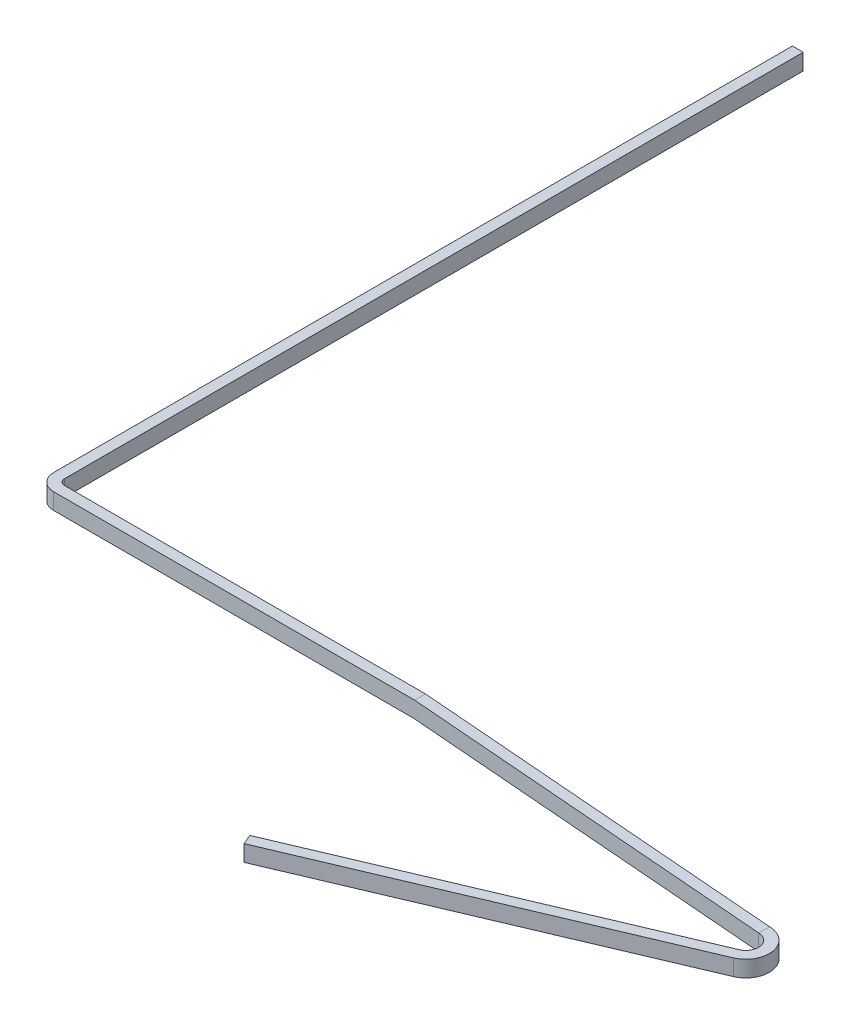
ISO-10303-21;
HEADER;
FILE_DESCRIPTION(('STEP AP214'),'2;1');
FILE_NAME('part.step','',(''),(''),'','','');
FILE_SCHEMA(('AUTOMOTIVE_DESIGN { 1 0 10303 214 1 1 1 1 }'));
ENDSEC;
DATA;
#1=APPLICATION_CONTEXT('core data for automotive mechanical design processes');
#2=APPLICATION_PROTOCOL_DEFINITION('international standard','automotive_design',2000,#1);
#3=PRODUCT_CONTEXT('',#1,'mechanical');
#4=PRODUCT('Part','Part','',(#3));
#5=PRODUCT_RELATED_PRODUCT_CATEGORY('part','',(#4));
#6=PRODUCT_DEFINITION_FORMATION('','',#4);
#7=PRODUCT_DEFINITION_CONTEXT('part definition',#1,'design');
#8=PRODUCT_DEFINITION('design','',#6,#7);
#9=PRODUCT_DEFINITION_SHAPE('','',#8);
#10=(LENGTH_UNIT() NAMED_UNIT(*) SI_UNIT(.MILLI.,.METRE.));
#11=(NAMED_UNIT(*) PLANE_ANGLE_UNIT() SI_UNIT($,.RADIAN.));
#12=(NAMED_UNIT(*) SI_UNIT($,.STERADIAN.) SOLID_ANGLE_UNIT());
#13=UNCERTAINTY_MEASURE_WITH_UNIT(LENGTH_MEASURE(1.E-05),#10,'distance_accuracy_value','');
#14=(GEOMETRIC_REPRESENTATION_CONTEXT(3) GLOBAL_UNCERTAINTY_ASSIGNED_CONTEXT((#13)) GLOBAL_UNIT_ASSIGNED_CONTEXT((#10,
#11,#12)) REPRESENTATION_CONTEXT('',''));
#15=CARTESIAN_POINT('',(0.,0.,0.));
#16=DIRECTION('',(0.,0.,1.));
#17=DIRECTION('',(1.,0.,0.));
#18=AXIS2_PLACEMENT_3D('',#15,#16,#17);
#19=CARTESIAN_POINT('',(0.31,-1.05262000002874,20.64));
#20=DIRECTION('',(0.,0.,-1.));
#21=DIRECTION('',(0.,1.,0.));
#22=AXIS2_PLACEMENT_3D('',#19,#20,#21);
#23=PLANE('',#22);
#24=DIRECTION('',(1.,0.,0.));
#25=VECTOR('',#24,1.);
#26=CARTESIAN_POINT('',(5.07517399165728,-0.225,20.64));
#27=LINE('',#26,#25);
#28=CARTESIAN_POINT('',(0.31,-0.225,20.64));
#29=VERTEX_POINT('',#28);
#30=CARTESIAN_POINT('',(10.3003479833146,-0.225,20.64));
#31=VERTEX_POINT('',#30);
#32=EDGE_CURVE('E192',#29,#31,#27,.T.);
#33=ORIENTED_EDGE('',*,*,#32,.F.);
#34=DIRECTION('',(0.,-1.,0.));
#35=VECTOR('',#34,1.);
#36=CARTESIAN_POINT('',(0.31,0.,20.64));
#37=LINE('',#36,#35);
#38=CARTESIAN_POINT('',(0.31,0.225,20.64));
#39=VERTEX_POINT('',#38);
#40=EDGE_CURVE('E152',#39,#29,#37,.T.);
#41=ORIENTED_EDGE('',*,*,#40,.F.);
#42=DIRECTION('',(-1.,0.,0.));
#43=VECTOR('',#42,1.);
#44=CARTESIAN_POINT('',(5.08482600834272,0.225,20.64));
#45=LINE('',#44,#43);
#46=CARTESIAN_POINT('',(10.3196520166854,0.225,20.64));
#47=VERTEX_POINT('',#46);
#48=EDGE_CURVE('E149',#47,#39,#45,.T.);
#49=ORIENTED_EDGE('',*,*,#48,.F.);
#50=DIRECTION('',(-0.996326309019234,0.0856381104188439,0.));
#51=VECTOR('',#50,1.);
#52=CARTESIAN_POINT('',(15.0896520166854,-0.185,20.64));
#53=LINE('',#52,#51);
#54=CARTESIAN_POINT('',(19.8596515427837,-0.595,20.6400404185195));
#55=VERTEX_POINT('',#54);
#56=EDGE_CURVE('E138',#55,#47,#53,.T.);
#57=ORIENTED_EDGE('',*,*,#56,.F.);
#58=CARTESIAN_POINT('',(19.8403479832355,-1.04500000000048,20.6399976074993));
#59=CARTESIAN_POINT('',(19.8410557517331,-1.02624965485285,20.6399975918096));
#60=CARTESIAN_POINT('',(19.8417718971182,-1.00749962029694,20.6399975950357));
#61=CARTESIAN_POINT('',(19.8432255705605,-0.969999551143934,20.6399976941499));
#62=CARTESIAN_POINT('',(19.8439630995611,-0.951249516583446,20.6399977900421));
#63=CARTESIAN_POINT('',(19.8454641491901,-0.913749439144669,20.6399981293394));
#64=CARTESIAN_POINT('',(19.8462276712638,-0.89499939632408,20.6399983727527));
#65=CARTESIAN_POINT('',(19.8477859711793,-0.857499324094485,20.6399988555051));
#66=CARTESIAN_POINT('',(19.8485807511506,-0.838749294773724,20.6399990948439));
#67=CARTESIAN_POINT('',(19.8502041974186,-0.801249378775152,20.6400002436646));
#68=CARTESIAN_POINT('',(19.8510328661086,-0.782499492201277,20.640001153194));
#69=CARTESIAN_POINT('',(19.8527078000249,-0.744999591802991,20.6400075352819));
#70=CARTESIAN_POINT('',(19.8535540661088,-0.726249578017113,20.6400130080634));
#71=CARTESIAN_POINT('',(19.8552657138619,-0.68874957837579,20.6400276802666));
#72=CARTESIAN_POINT('',(19.8561310963895,-0.669999592559558,20.6400368798558));
#73=CARTESIAN_POINT('',(19.8578787320751,-0.632499620895884,20.6400591797775));
#74=CARTESIAN_POINT('',(19.8587609859392,-0.613749635081437,20.6400722802736));
#75=CARTESIAN_POINT('',(19.8596505349446,-0.595,20.640087417897));
#76=B_SPLINE_CURVE_WITH_KNOTS('',3,(#58,#59,#60,#61,#62,#63,#64,#65,#66,#67,#68,#69,#70,#71,#72,
#73,#74,#75),.UNSPECIFIED.,.F.,.F.,(4,2,2,2,2,2,2,2,4),(0.,0.056291101953052,0.112584691452661,
0.168881416278623,0.225181983163097,0.281486533129505,0.337793833823625,0.394103667974869,
0.450415864321464),.UNSPECIFIED.);
#77=CARTESIAN_POINT('',(19.8403479832985,-1.04500000000571,20.6399995214999));
#78=VERTEX_POINT('',#77);
#79=EDGE_CURVE('E216',#55,#78,#76,.F.);
#80=ORIENTED_EDGE('',*,*,#79,.T.);
#81=DIRECTION('',(0.996326309019234,-0.0856381104188441,0.));
#82=VECTOR('',#81,1.);
#83=CARTESIAN_POINT('',(15.0703479833146,-0.635,20.64));
#84=LINE('',#83,#82);
#85=EDGE_CURVE('E171',#31,#78,#84,.T.);
#86=ORIENTED_EDGE('',*,*,#85,.F.);
#87=EDGE_LOOP('',(#33,#41,#49,#57,#80,#86));
#88=FACE_BOUND('',#87,.T.);
#89=ADVANCED_FACE('F15',(#88),#23,.T.);
#90=CARTESIAN_POINT('',(0.31,-0.27,20.48));
#91=DIRECTION('',(0.,1.,0.));
#92=DIRECTION('',(0.,0.,1.));
#93=AXIS2_PLACEMENT_3D('',#90,#91,#92);
#94=CYLINDRICAL_SURFACE('',#93,0.160000000000002);
#95=DIRECTION('',(0.,-1.,0.));
#96=VECTOR('',#95,1.);
#97=CARTESIAN_POINT('',(0.15,0.,20.48));
#98=LINE('',#97,#96);
#99=CARTESIAN_POINT('',(0.149999999999986,0.225,20.48));
#100=VERTEX_POINT('',#99);
#101=CARTESIAN_POINT('',(0.149999999999981,-0.225,20.48));
#102=VERTEX_POINT('',#101);
#103=EDGE_CURVE('E93',#100,#102,#98,.T.);
#104=ORIENTED_EDGE('',*,*,#103,.F.);
#105=CARTESIAN_POINT('',(0.31,0.225,20.48));
#106=DIRECTION('',(0.,1.,0.));
#107=DIRECTION('',(0.,0.,1.));
#108=AXIS2_PLACEMENT_3D('',#105,#106,#107);
#109=CIRCLE('',#108,0.160000000000002);
#110=EDGE_CURVE('E156',#39,#100,#109,.F.);
#111=ORIENTED_EDGE('',*,*,#110,.F.);
#112=ORIENTED_EDGE('',*,*,#40,.T.);
#113=CARTESIAN_POINT('',(0.31,-0.225,20.48));
#114=DIRECTION('',(0.,1.,0.));
#115=DIRECTION('',(0.,0.,1.));
#116=AXIS2_PLACEMENT_3D('',#113,#114,#115);
#117=CIRCLE('',#116,0.160000000000002);
#118=EDGE_CURVE('E19',#102,#29,#117,.T.);
#119=ORIENTED_EDGE('',*,*,#118,.F.);
#120=EDGE_LOOP('',(#104,#111,#112,#119));
#121=FACE_BOUND('',#120,.T.);
#122=ADVANCED_FACE('F367',(#121),#94,.F.);
#123=CARTESIAN_POINT('',(0.15,-0.225,0.));
#124=DIRECTION('',(1.,0.,0.));
#125=DIRECTION('',(0.,1.,0.));
#126=AXIS2_PLACEMENT_3D('',#123,#124,#125);
#127=PLANE('',#126);
#128=DIRECTION('',(0.,-1.,0.));
#129=VECTOR('',#128,1.);
#130=CARTESIAN_POINT('',(0.15,0.,0.));
#131=LINE('',#130,#129);
#132=CARTESIAN_POINT('',(0.149999999999981,0.225,0.));
#133=VERTEX_POINT('',#132);
#134=CARTESIAN_POINT('',(0.149999999999981,-0.225,0.));
#135=VERTEX_POINT('',#134);
#136=EDGE_CURVE('E105',#133,#135,#131,.T.);
#137=ORIENTED_EDGE('',*,*,#136,.F.);
#138=DIRECTION('',(0.,0.,-1.));
#139=VECTOR('',#138,1.);
#140=CARTESIAN_POINT('',(0.149999999999971,0.225,10.47));
#141=LINE('',#140,#139);
#142=EDGE_CURVE('E209',#100,#133,#141,.T.);
#143=ORIENTED_EDGE('',*,*,#142,.F.);
#144=ORIENTED_EDGE('',*,*,#103,.T.);
#145=DIRECTION('',(0.,0.,1.));
#146=VECTOR('',#145,1.);
#147=CARTESIAN_POINT('',(0.149999999999962,-0.225,10.47));
#148=LINE('',#147,#146);
#149=EDGE_CURVE('E183',#135,#102,#148,.T.);
#150=ORIENTED_EDGE('',*,*,#149,.F.);
#151=EDGE_LOOP('',(#137,#143,#144,#150));
#152=FACE_BOUND('',#151,.T.);
#153=ADVANCED_FACE('F369',(#152),#127,.T.);
#154=CARTESIAN_POINT('',(0.15,-0.225,0.));
#155=DIRECTION('',(0.,0.,-1.));
#156=DIRECTION('',(-1.,0.,0.));
#157=AXIS2_PLACEMENT_3D('',#154,#155,#156);
#158=PLANE('',#157);
#159=DIRECTION('',(0.,-1.,0.));
#160=VECTOR('',#159,1.);
#161=CARTESIAN_POINT('',(-0.15,0.,0.));
#162=LINE('',#161,#160);
#163=CARTESIAN_POINT('',(-0.15,0.225,0.));
#164=VERTEX_POINT('',#163);
#165=CARTESIAN_POINT('',(-0.15,-0.225,0.));
#166=VERTEX_POINT('',#165);
#167=EDGE_CURVE('E197',#164,#166,#162,.T.);
#168=ORIENTED_EDGE('',*,*,#167,.F.);
#169=DIRECTION('',(-1.,0.,0.));
#170=VECTOR('',#169,1.);
#171=CARTESIAN_POINT('',(5.08482600834272,0.225,0.));
#172=LINE('',#171,#170);
#173=EDGE_CURVE('E205',#133,#164,#172,.T.);
#174=ORIENTED_EDGE('',*,*,#173,.F.);
#175=ORIENTED_EDGE('',*,*,#136,.T.);
#176=DIRECTION('',(1.,0.,0.));
#177=VECTOR('',#176,1.);
#178=CARTESIAN_POINT('',(5.07517399165728,-0.225,0.));
#179=LINE('',#178,#177);
#180=EDGE_CURVE('E186',#166,#135,#179,.T.);
#181=ORIENTED_EDGE('',*,*,#180,.F.);
#182=EDGE_LOOP('',(#168,#174,#175,#181));
#183=FACE_BOUND('',#182,.T.);
#184=ADVANCED_FACE('F371',(#183),#158,.T.);
#185=CARTESIAN_POINT('',(-0.15,0.225,0.));
#186=DIRECTION('',(-1.,0.,0.));
#187=DIRECTION('',(0.,-1.,0.));
#188=AXIS2_PLACEMENT_3D('',#185,#186,#187);
#189=PLANE('',#188);
#190=DIRECTION('',(0.,0.,1.));
#191=VECTOR('',#190,1.);
#192=CARTESIAN_POINT('',(-0.15,0.225,10.47));
#193=LINE('',#192,#191);
#194=CARTESIAN_POINT('',(-0.15,0.225,20.48));
#195=VERTEX_POINT('',#194);
#196=EDGE_CURVE('E208',#164,#195,#193,.T.);
#197=ORIENTED_EDGE('',*,*,#196,.F.);
#198=ORIENTED_EDGE('',*,*,#167,.T.);
#199=DIRECTION('',(0.,0.,-1.));
#200=VECTOR('',#199,1.);
#201=CARTESIAN_POINT('',(-0.15,-0.225,10.47));
#202=LINE('',#201,#200);
#203=CARTESIAN_POINT('',(-0.15,-0.225,20.48));
#204=VERTEX_POINT('',#203);
#205=EDGE_CURVE('E189',#204,#166,#202,.T.);
#206=ORIENTED_EDGE('',*,*,#205,.F.);
#207=DIRECTION('',(0.,1.,0.));
#208=VECTOR('',#207,1.);
#209=CARTESIAN_POINT('',(-0.15,0.,20.48));
#210=LINE('',#209,#208);
#211=EDGE_CURVE('E200',#204,#195,#210,.T.);
#212=ORIENTED_EDGE('',*,*,#211,.T.);
#213=EDGE_LOOP('',(#197,#198,#206,#212));
#214=FACE_BOUND('',#213,.T.);
#215=ADVANCED_FACE('F404',(#214),#189,.T.);
#216=CARTESIAN_POINT('',(-0.15,-0.225,20.94));
#217=DIRECTION('',(0.,-1.,0.));
#218=DIRECTION('',(0.,0.,-1.));
#219=AXIS2_PLACEMENT_3D('',#216,#217,#218);
#220=PLANE('',#219);
#221=ORIENTED_EDGE('',*,*,#149,.T.);
#222=ORIENTED_EDGE('',*,*,#118,.T.);
#223=ORIENTED_EDGE('',*,*,#32,.T.);
#224=DIRECTION('',(0.,0.,-1.));
#225=VECTOR('',#224,1.);
#226=CARTESIAN_POINT('',(10.3003479833146,-0.225,20.79));
#227=LINE('',#226,#225);
#228=CARTESIAN_POINT('',(10.3003479833146,-0.224999999999997,20.94));
#229=VERTEX_POINT('',#228);
#230=EDGE_CURVE('E170',#229,#31,#227,.T.);
#231=ORIENTED_EDGE('',*,*,#230,.F.);
#232=DIRECTION('',(1.,0.,0.));
#233=VECTOR('',#232,1.);
#234=CARTESIAN_POINT('',(10.1434749643928,-0.224999999999998,20.94));
#235=LINE('',#234,#233);
#236=CARTESIAN_POINT('',(0.310000000000003,-0.224999999999999,20.94));
#237=VERTEX_POINT('',#236);
#238=EDGE_CURVE('E178',#237,#229,#235,.T.);
#239=ORIENTED_EDGE('',*,*,#238,.F.);
#240=CARTESIAN_POINT('',(0.310000000000006,-0.225,20.48));
#241=DIRECTION('',(0.,1.,0.));
#242=DIRECTION('',(0.,0.,1.));
#243=AXIS2_PLACEMENT_3D('',#240,#241,#242);
#244=CIRCLE('',#243,0.460000000000002);
#245=EDGE_CURVE('E339',#204,#237,#244,.T.);
#246=ORIENTED_EDGE('',*,*,#245,.F.);
#247=ORIENTED_EDGE('',*,*,#205,.T.);
#248=ORIENTED_EDGE('',*,*,#180,.T.);
#249=EDGE_LOOP('',(#221,#222,#223,#231,#239,#246,#247,#248));
#250=FACE_BOUND('',#249,.T.);
#251=ADVANCED_FACE('F379',(#250),#220,.T.);
#252=CARTESIAN_POINT('',(10.3003479833146,-0.225,20.64));
#253=DIRECTION('',(-0.0856381104188441,-0.996326309019234,0.));
#254=DIRECTION('',(0.996326309019234,-0.0856381104188441,0.));
#255=AXIS2_PLACEMENT_3D('',#252,#253,#254);
#256=PLANE('',#255);
#257=DIRECTION('',(0.996326309019234,-0.0856381104188441,0.));
#258=VECTOR('',#257,1.);
#259=CARTESIAN_POINT('',(10.3003479833146,-0.224999999999998,20.94));
#260=LINE('',#259,#258);
#261=CARTESIAN_POINT('',(19.8403479833014,-1.045,20.9399997496721));
#262=VERTEX_POINT('',#261);
#263=EDGE_CURVE('E181',#229,#262,#260,.T.);
#264=ORIENTED_EDGE('',*,*,#263,.F.);
#265=ORIENTED_EDGE('',*,*,#230,.T.);
#266=ORIENTED_EDGE('',*,*,#85,.T.);
#267=DIRECTION('',(0.,0.,1.));
#268=VECTOR('',#267,1.);
#269=CARTESIAN_POINT('',(19.8403479833145,-1.045,20.79));
#270=LINE('',#269,#268);
#271=EDGE_CURVE('E128',#78,#262,#270,.T.);
#272=ORIENTED_EDGE('',*,*,#271,.T.);
#273=EDGE_LOOP('',(#264,#265,#266,#272));
#274=FACE_BOUND('',#273,.T.);
#275=ADVANCED_FACE('F394',(#274),#256,.T.);
#276=CARTESIAN_POINT('',(19.8596520166855,-0.595,20.64));
#277=DIRECTION('',(0.0856381104188439,0.996326309019234,0.));
#278=DIRECTION('',(-0.996326309019234,0.0856381104188439,0.));
#279=AXIS2_PLACEMENT_3D('',#276,#277,#278);
#280=PLANE('',#279);
#281=ORIENTED_EDGE('',*,*,#56,.T.);
#282=DIRECTION('',(0.,0.,-1.));
#283=VECTOR('',#282,1.);
#284=CARTESIAN_POINT('',(10.3196520166854,0.225,10.47));
#285=LINE('',#284,#283);
#286=CARTESIAN_POINT('',(10.3196520166855,0.224999999999999,20.94));
#287=VERTEX_POINT('',#286);
#288=EDGE_CURVE('E143',#287,#47,#285,.T.);
#289=ORIENTED_EDGE('',*,*,#288,.F.);
#290=DIRECTION('',(-0.996326309019234,0.0856381104188441,0.));
#291=VECTOR('',#290,1.);
#292=CARTESIAN_POINT('',(19.8596520166855,-0.595000000000001,20.94));
#293=LINE('',#292,#291);
#294=CARTESIAN_POINT('',(19.8596517879955,-0.595000000175899,20.9400614006836));
#295=VERTEX_POINT('',#294);
#296=EDGE_CURVE('E351',#295,#287,#293,.T.);
#297=ORIENTED_EDGE('',*,*,#296,.F.);
#298=DIRECTION('',(0.,0.,1.));
#299=VECTOR('',#298,1.);
#300=CARTESIAN_POINT('',(19.8596520166855,-0.595000000000001,20.64));
#301=LINE('',#300,#299);
#302=EDGE_CURVE('E145',#295,#55,#301,.F.);
#303=ORIENTED_EDGE('',*,*,#302,.T.);
#304=EDGE_LOOP('',(#281,#289,#297,#303));
#305=FACE_BOUND('',#304,.T.);
#306=ADVANCED_FACE('F140',(#305),#280,.T.);
#307=CARTESIAN_POINT('',(-0.15,0.225,0.));
#308=DIRECTION('',(0.,1.,0.));
#309=DIRECTION('',(0.,0.,1.));
#310=AXIS2_PLACEMENT_3D('',#307,#308,#309);
#311=PLANE('',#310);
#312=ORIENTED_EDGE('',*,*,#196,.T.);
#313=CARTESIAN_POINT('',(0.310000000000006,0.225,20.48));
#314=DIRECTION('',(0.,1.,0.));
#315=DIRECTION('',(0.,0.,1.));
#316=AXIS2_PLACEMENT_3D('',#313,#314,#315);
#317=CIRCLE('',#316,0.460000000000002);
#318=CARTESIAN_POINT('',(0.310000000000003,0.225,20.94));
#319=VERTEX_POINT('',#318);
#320=EDGE_CURVE('E182',#319,#195,#317,.F.);
#321=ORIENTED_EDGE('',*,*,#320,.F.);
#322=DIRECTION('',(-1.,0.,0.));
#323=VECTOR('',#322,1.);
#324=CARTESIAN_POINT('',(10.1434749643928,0.225,20.94));
#325=LINE('',#324,#323);
#326=EDGE_CURVE('E161',#287,#319,#325,.T.);
#327=ORIENTED_EDGE('',*,*,#326,.F.);
#328=ORIENTED_EDGE('',*,*,#288,.T.);
#329=ORIENTED_EDGE('',*,*,#48,.T.);
#330=ORIENTED_EDGE('',*,*,#110,.T.);
#331=ORIENTED_EDGE('',*,*,#142,.T.);
#332=ORIENTED_EDGE('',*,*,#173,.T.);
#333=EDGE_LOOP('',(#312,#321,#327,#328,#329,#330,#331,#332));
#334=FACE_BOUND('',#333,.T.);
#335=ADVANCED_FACE('F159',(#334),#311,.T.);
#336=CARTESIAN_POINT('',(0.310000000000006,-0.27,20.48));
#337=DIRECTION('',(0.,1.,0.));
#338=DIRECTION('',(0.,0.,1.));
#339=AXIS2_PLACEMENT_3D('',#336,#337,#338);
#340=CYLINDRICAL_SURFACE('',#339,0.460000000000002);
#341=ORIENTED_EDGE('',*,*,#320,.T.);
#342=ORIENTED_EDGE('',*,*,#211,.F.);
#343=ORIENTED_EDGE('',*,*,#245,.T.);
#344=DIRECTION('',(0.,-1.,0.));
#345=VECTOR('',#344,1.);
#346=CARTESIAN_POINT('',(0.31,-0.41381,20.94));
#347=LINE('',#346,#345);
#348=EDGE_CURVE('E347',#319,#237,#347,.T.);
#349=ORIENTED_EDGE('',*,*,#348,.F.);
#350=EDGE_LOOP('',(#341,#342,#343,#349));
#351=FACE_BOUND('',#350,.T.);
#352=ADVANCED_FACE('F375',(#351),#340,.T.);
#353=CARTESIAN_POINT('',(0.31,0.225,20.94));
#354=DIRECTION('',(0.,0.,1.));
#355=DIRECTION('',(0.,-1.,0.));
#356=AXIS2_PLACEMENT_3D('',#353,#354,#355);
#357=PLANE('',#356);
#358=ORIENTED_EDGE('',*,*,#326,.T.);
#359=ORIENTED_EDGE('',*,*,#348,.T.);
#360=ORIENTED_EDGE('',*,*,#238,.T.);
#361=ORIENTED_EDGE('',*,*,#263,.T.);
#362=CARTESIAN_POINT('',(19.8596493125987,-0.595,20.9401105712543));
#363=CARTESIAN_POINT('',(19.8589070543995,-0.61231450722905,20.9400924199582));
#364=CARTESIAN_POINT('',(19.8581684943643,-0.629629174566504,20.9400769092264));
#365=CARTESIAN_POINT('',(19.8566783989732,-0.66466860724553,20.9400502538868));
#366=CARTESIAN_POINT('',(19.8559269703653,-0.682393377215631,20.9400392213343));
#367=CARTESIAN_POINT('',(19.8544082647592,-0.718252994646044,20.9400212052548));
#368=CARTESIAN_POINT('',(19.8536410232386,-0.73638784365678,20.9400143212937));
#369=CARTESIAN_POINT('',(19.8520907431335,-0.773067700964002,20.9400045568551));
#370=CARTESIAN_POINT('',(19.8513077396674,-0.791612710757335,20.9400017704308));
#371=CARTESIAN_POINT('',(19.849717328899,-0.829112877938759,20.9399991519511));
#372=CARTESIAN_POINT('',(19.8489097650296,-0.848068028757006,20.9399993866476));
#373=CARTESIAN_POINT('',(19.8472558849673,-0.886388201692705,20.9399993410354));
#374=CARTESIAN_POINT('',(19.8464091082284,-0.905753203911115,20.9399990494556));
#375=CARTESIAN_POINT('',(19.8446964668445,-0.944893390991332,20.9399987267892));
#376=CARTESIAN_POINT('',(19.8438305778481,-0.964668574747826,20.939998701352));
#377=CARTESIAN_POINT('',(19.8420892232089,-1.0046290314408,20.9399987226015));
#378=CARTESIAN_POINT('',(19.8412139308584,-1.02481431191399,20.9399987707934));
#379=CARTESIAN_POINT('',(19.8403479832488,-1.045,20.9399987483605));
#380=B_SPLINE_CURVE_WITH_KNOTS('',3,(#362,#363,#364,#365,#366,#367,#368,#369,#370,#371,#372,
#373,#374,#375,#376,#377,#378,#379),.UNSPECIFIED.,.F.,.F.,(4,2,2,2,2,2,2,2,4),(0.,
0.0519912559621775,0.105213338072925,0.159666556649172,0.215351155140958,0.27226818402837,
0.330418699177772,0.389801094696052,0.450413844254339),.UNSPECIFIED.);
#381=EDGE_CURVE('E323',#295,#262,#380,.T.);
#382=ORIENTED_EDGE('',*,*,#381,.F.);
#383=ORIENTED_EDGE('',*,*,#296,.T.);
#384=EDGE_LOOP('',(#358,#359,#360,#361,#382,#383));
#385=FACE_BOUND('',#384,.T.);
#386=ADVANCED_FACE('F298',(#385),#357,.T.);
#387=CARTESIAN_POINT('',(10.4011459881948,-0.595,20.6083412707113));
#388=DIRECTION('',(0.,1.,0.));
#389=DIRECTION('',(0.,0.,1.));
#390=AXIS2_PLACEMENT_3D('',#387,#388,#389);
#391=PLANE('',#390);
#392=ORIENTED_EDGE('',*,*,#302,.F.);
#393=CARTESIAN_POINT('',(19.9866547004469,-0.595,21.6122196344821));
#394=CARTESIAN_POINT('',(20.0229846054847,-0.595,21.5968474313605));
#395=CARTESIAN_POINT('',(20.0565777358398,-0.595,21.5750655184157));
#396=CARTESIAN_POINT('',(20.1149116764851,-0.595,21.5218304574681));
#397=CARTESIAN_POINT('',(20.1396574039357,-0.595,21.490382699626));
#398=CARTESIAN_POINT('',(20.1769509364112,-0.595,21.4209675127919));
#399=CARTESIAN_POINT('',(20.189508376294,-0.595,21.3830052615003));
#400=CARTESIAN_POINT('',(20.2016718922345,-0.595,21.3052220282202));
#401=CARTESIAN_POINT('',(20.2013293384784,-0.595,21.2654090491298));
#402=CARTESIAN_POINT('',(20.1871273477636,-0.595,21.1880163159376));
#403=CARTESIAN_POINT('',(20.1731906065863,-0.595,21.1504506382719));
#404=CARTESIAN_POINT('',(20.1340701818549,-0.595,21.0821573496042));
#405=CARTESIAN_POINT('',(20.1089707797616,-0.595,21.0513810344694));
#406=CARTESIAN_POINT('',(20.0495599392355,-0.595,20.9997188072483));
#407=CARTESIAN_POINT('',(20.0151693856629,-0.595,20.9789223056023));
#408=CARTESIAN_POINT('',(19.9595495595695,-0.595,20.9569613943345));
#409=CARTESIAN_POINT('',(19.9400139722403,-0.595,20.9511669474463));
#410=CARTESIAN_POINT('',(19.9002334545909,-0.595,20.9430270318809));
#411=CARTESIAN_POINT('',(19.8799884117047,-0.595,20.940682113084));
#412=CARTESIAN_POINT('',(19.8596505845451,-0.595,20.940110602363));
#413=B_SPLINE_CURVE_WITH_KNOTS('',3,(#393,#394,#395,#396,#397,#398,#399,#400,#401,#402,#403,
#404,#405,#406,#407,#408,#409,#410,#411,#412),.UNSPECIFIED.,.F.,.F.,(4,2,2,2,2,2,2,2,2,4),(0.,
0.117848235520281,0.235630871813625,0.353320324757056,0.470541166045252,0.588432500609252,
0.705448444951843,0.823494035109667,0.884361300873737,0.945238268280727),.UNSPECIFIED.);
#414=CARTESIAN_POINT('',(19.9866547004469,-0.595,21.6122196344821));
#415=VERTEX_POINT('',#414);
#416=EDGE_CURVE('E317',#415,#295,#413,.T.);
#417=ORIENTED_EDGE('',*,*,#416,.F.);
#418=DIRECTION('',(0.920627527091691,0.,-0.390442001276808));
#419=VECTOR('',#418,1.);
#420=CARTESIAN_POINT('',(15.2240442001277,-0.595,23.6320627527092));
#421=LINE('',#420,#419);
#422=CARTESIAN_POINT('',(10.4614336998085,-0.595,25.6519058709363));
#423=VERTEX_POINT('',#422);
#424=EDGE_CURVE('E326',#423,#415,#421,.T.);
#425=ORIENTED_EDGE('',*,*,#424,.F.);
#426=DIRECTION('',(0.390442001276933,0.,0.920627527091637));
#427=VECTOR('',#426,1.);
#428=CARTESIAN_POINT('',(10.4614336998085,-0.595,25.6519058709363));
#429=LINE('',#428,#427);
#430=CARTESIAN_POINT('',(10.5785663001915,-0.595,25.9280941290638));
#431=VERTEX_POINT('',#430);
#432=EDGE_CURVE('E336',#423,#431,#429,.T.);
#433=ORIENTED_EDGE('',*,*,#432,.T.);
#434=DIRECTION('',(-0.920627527091691,0.,0.390442001276807));
#435=VECTOR('',#434,1.);
#436=CARTESIAN_POINT('',(15.3411768005107,-0.595,23.9082510108367));
#437=LINE('',#436,#435);
#438=CARTESIAN_POINT('',(20.1037873008299,-0.595,21.8884078926096));
#439=VERTEX_POINT('',#438);
#440=EDGE_CURVE('E333',#439,#431,#437,.T.);
#441=ORIENTED_EDGE('',*,*,#440,.F.);
#442=CARTESIAN_POINT('',(19.8596507460644,-0.595,20.6400874214755));
#443=CARTESIAN_POINT('',(19.8979981894397,-0.595,20.6406509025761));
#444=CARTESIAN_POINT('',(19.936192133001,-0.595,20.6446120795249));
#445=CARTESIAN_POINT('',(20.0112827251633,-0.595,20.6591611158423));
#446=CARTESIAN_POINT('',(20.0481797912725,-0.595,20.6697468215297));
#447=CARTESIAN_POINT('',(20.1524185666312,-0.595,20.7100097029625));
#448=CARTESIAN_POINT('',(20.2167468903138,-0.595,20.7482931112192));
#449=CARTESIAN_POINT('',(20.3002386440367,-0.595,20.8198108374397));
#450=CARTESIAN_POINT('',(20.3258715634816,-0.595,20.8459454889009));
#451=CARTESIAN_POINT('',(20.3724358679384,-0.595,20.9021012833346));
#452=CARTESIAN_POINT('',(20.3933730652019,-0.595,20.9321175483316));
#453=CARTESIAN_POINT('',(20.4301352109327,-0.595,20.9953391348916));
#454=CARTESIAN_POINT('',(20.4459328486757,-0.595,21.0285603147116));
#455=CARTESIAN_POINT('',(20.471715819635,-0.595,21.0971439371283));
#456=CARTESIAN_POINT('',(20.4817059050276,-0.595,21.1325046028004));
#457=CARTESIAN_POINT('',(20.5021170117197,-0.595,21.2399856483591));
#458=CARTESIAN_POINT('',(20.5032814791069,-0.595,21.3140263728989));
#459=CARTESIAN_POINT('',(20.4815978893159,-0.595,21.4587449552475));
#460=CARTESIAN_POINT('',(20.458676586587,-0.595,21.5294118681019));
#461=CARTESIAN_POINT('',(20.4074780637952,-0.595,21.6262518318854));
#462=CARTESIAN_POINT('',(20.3875729576136,-0.595,21.6570384834287));
#463=CARTESIAN_POINT('',(20.3429176210416,-0.595,21.7148579146254));
#464=CARTESIAN_POINT('',(20.3181702309512,-0.595,21.7418928790633));
#465=CARTESIAN_POINT('',(20.2638731167629,-0.595,21.7921612459312));
#466=CARTESIAN_POINT('',(20.2342162570259,-0.595,21.8152790020911));
#467=CARTESIAN_POINT('',(20.1714153049914,-0.595,21.8560881751001));
#468=CARTESIAN_POINT('',(20.1382737881934,-0.595,21.8737835622641));
#469=CARTESIAN_POINT('',(20.1037873008299,-0.595,21.8884078926096));
#470=B_SPLINE_CURVE_WITH_KNOTS('',3,(#442,#443,#444,#445,#446,#447,#448,#449,#450,#451,#452,
#453,#454,#455,#456,#457,#458,#459,#460,#461,#462,#463,#464,#465,#466,#467,#468,#469),
.UNSPECIFIED.,.F.,.F.,(4,2,2,2,2,2,2,2,2,2,2,2,2,4),(0.,0.114701402814958,0.229365534750529,
0.448882638295282,0.558289392335112,0.667559968631984,0.777402049927794,0.887154123190953,
1.10494580250514,1.3234017148731,1.43290939666249,1.54235303691723,1.65461127184137,
1.76678711262164),.UNSPECIFIED.);
#471=EDGE_CURVE('E315',#55,#439,#470,.T.);
#472=ORIENTED_EDGE('',*,*,#471,.F.);
#473=EDGE_LOOP('',(#392,#417,#425,#433,#441,#472));
#474=FACE_BOUND('',#473,.T.);
#475=ADVANCED_FACE('F294',(#474),#391,.T.);
#476=CARTESIAN_POINT('',(10.5785663001915,-1.045,25.9280941290638));
#477=DIRECTION('',(0.390442001276807,0.,0.920627527091691));
#478=DIRECTION('',(0.920627527091691,0.,-0.390442001276807));
#479=AXIS2_PLACEMENT_3D('',#476,#477,#478);
#480=PLANE('',#479);
#481=DIRECTION('',(-0.920627527091691,0.,0.390442001276806));
#482=VECTOR('',#481,1.);
#483=CARTESIAN_POINT('',(20.1037873008299,-1.045,21.8884078926096));
#484=LINE('',#483,#482);
#485=CARTESIAN_POINT('',(20.1037873008299,-1.045,21.8884078926096));
#486=VERTEX_POINT('',#485);
#487=CARTESIAN_POINT('',(10.5785663001915,-1.045,25.9280941290638));
#488=VERTEX_POINT('',#487);
#489=EDGE_CURVE('E390',#486,#488,#484,.T.);
#490=ORIENTED_EDGE('',*,*,#489,.F.);
#491=DIRECTION('',(0.,-1.,0.));
#492=VECTOR('',#491,1.);
#493=CARTESIAN_POINT('',(20.1037873008299,-0.82,21.8884078926096));
#494=LINE('',#493,#492);
#495=EDGE_CURVE('E237',#439,#486,#494,.T.);
#496=ORIENTED_EDGE('',*,*,#495,.F.);
#497=ORIENTED_EDGE('',*,*,#440,.T.);
#498=DIRECTION('',(0.,-1.,0.));
#499=VECTOR('',#498,1.);
#500=CARTESIAN_POINT('',(10.5785663001915,-0.82,25.9280941290638));
#501=LINE('',#500,#499);
#502=EDGE_CURVE('E330',#431,#488,#501,.T.);
#503=ORIENTED_EDGE('',*,*,#502,.T.);
#504=EDGE_LOOP('',(#490,#496,#497,#503));
#505=FACE_BOUND('',#504,.T.);
#506=ADVANCED_FACE('F290',(#505),#480,.T.);
#507=CARTESIAN_POINT('',(19.9866547004469,-1.045,21.6122196344821));
#508=DIRECTION('',(-0.390442001276808,0.,-0.92062752709169));
#509=DIRECTION('',(-0.92062752709169,0.,0.390442001276808));
#510=AXIS2_PLACEMENT_3D('',#507,#508,#509);
#511=PLANE('',#510);
#512=ORIENTED_EDGE('',*,*,#424,.T.);
#513=DIRECTION('',(0.,1.,0.));
#514=VECTOR('',#513,1.);
#515=CARTESIAN_POINT('',(19.9866547004469,-0.82,21.6122196344821));
#516=LINE('',#515,#514);
#517=CARTESIAN_POINT('',(19.9866547004469,-1.045,21.6122196344821));
#518=VERTEX_POINT('',#517);
#519=EDGE_CURVE('E319',#518,#415,#516,.T.);
#520=ORIENTED_EDGE('',*,*,#519,.F.);
#521=DIRECTION('',(0.920627527091693,0.,-0.390442001276802));
#522=VECTOR('',#521,1.);
#523=CARTESIAN_POINT('',(10.4614336998085,-1.045,25.6519058709362));
#524=LINE('',#523,#522);
#525=CARTESIAN_POINT('',(10.4614336998085,-1.045,25.6519058709363));
#526=VERTEX_POINT('',#525);
#527=EDGE_CURVE('E386',#526,#518,#524,.T.);
#528=ORIENTED_EDGE('',*,*,#527,.F.);
#529=DIRECTION('',(0.,1.,0.));
#530=VECTOR('',#529,1.);
#531=CARTESIAN_POINT('',(10.4614336998085,-0.82,25.6519058709363));
#532=LINE('',#531,#530);
#533=EDGE_CURVE('E33',#526,#423,#532,.T.);
#534=ORIENTED_EDGE('',*,*,#533,.T.);
#535=EDGE_LOOP('',(#512,#520,#528,#534));
#536=FACE_BOUND('',#535,.T.);
#537=ADVANCED_FACE('F286',(#536),#511,.T.);
#538=CARTESIAN_POINT('',(19.8317037945126,-0.595,20.9399995605906));
#539=CARTESIAN_POINT('',(19.8381587372541,-0.595,20.9399988759825));
#540=CARTESIAN_POINT('',(19.8447627578284,-0.595,20.9399978435567));
#541=CARTESIAN_POINT('',(19.8621521356986,-0.595,20.9400050036624));
#542=CARTESIAN_POINT('',(19.870007140301,-0.595,20.9404293407131));
#543=CARTESIAN_POINT('',(19.889926881481,-0.595,20.9421411552988));
#544=CARTESIAN_POINT('',(19.8998471744302,-0.595,20.9434237115378));
#545=CARTESIAN_POINT('',(19.9293875956988,-0.595,20.9485368718759));
#546=CARTESIAN_POINT('',(19.9487873442857,-0.595,20.9536365289768));
#547=CARTESIAN_POINT('',(20.0052507784796,-0.595,20.9737809426105));
#548=CARTESIAN_POINT('',(20.0405216586484,-0.595,20.9936915701845));
#549=CARTESIAN_POINT('',(20.1333611202902,-0.595,21.0695567491134));
#550=CARTESIAN_POINT('',(20.1770614585125,-0.595,21.1419473824125));
#551=CARTESIAN_POINT('',(20.2089077420625,-0.595,21.2986027848069));
#552=CARTESIAN_POINT('',(20.196940420691,-0.595,21.38230991122));
#553=CARTESIAN_POINT('',(20.1224741333578,-0.595,21.5237661692159));
#554=CARTESIAN_POINT('',(20.0603496853495,-0.595,21.5809652818338));
#555=CARTESIAN_POINT('',(19.9866547004469,-0.595,21.6122196344821));
#556=CARTESIAN_POINT('',(19.8317037945126,-1.045,20.9399995605906));
#557=CARTESIAN_POINT('',(19.8381587372541,-1.045,20.9399988759825));
#558=CARTESIAN_POINT('',(19.8447627578284,-1.045,20.9399978435567));
#559=CARTESIAN_POINT('',(19.8621521356986,-1.045,20.9400050036624));
#560=CARTESIAN_POINT('',(19.870007140301,-1.045,20.9404293407131));
#561=CARTESIAN_POINT('',(19.889926881481,-1.045,20.9421411552988));
#562=CARTESIAN_POINT('',(19.8998471744302,-1.045,20.9434237115378));
#563=CARTESIAN_POINT('',(19.9293875956988,-1.045,20.9485368718759));
#564=CARTESIAN_POINT('',(19.9487873442857,-1.045,20.9536365289768));
#565=CARTESIAN_POINT('',(20.0052507784796,-1.045,20.9737809426105));
#566=CARTESIAN_POINT('',(20.0405216586484,-1.045,20.9936915701845));
#567=CARTESIAN_POINT('',(20.1333611202902,-1.045,21.0695567491134));
#568=CARTESIAN_POINT('',(20.1770614585125,-1.045,21.1419473824125));
#569=CARTESIAN_POINT('',(20.2089077420625,-1.045,21.2986027848069));
#570=CARTESIAN_POINT('',(20.196940420691,-1.045,21.38230991122));
#571=CARTESIAN_POINT('',(20.1224741333578,-1.045,21.5237661692159));
#572=CARTESIAN_POINT('',(20.0603496853495,-1.045,21.5809652818338));
#573=CARTESIAN_POINT('',(19.9866547004469,-1.045,21.6122196344821));
#574=B_SPLINE_SURFACE_WITH_KNOTS('',1,3,((#538,#539,#540,#541,#542,#543,#544,#545,#546,#547,
#548,#549,#550,#551,#552,#553,#554,#555),(#556,#557,#558,#559,#560,#561,#562,#563,#564,#565,
#566,#567,#568,#569,#570,#571,#572,#573)),.UNSPECIFIED.,.F.,.F.,.F.,(2,2),(4,2,2,2,2,2,2,2,4),
(0.,1.),(-0.00157504199534,0.,0.00365461886833,0.00730923773665,0.0146184754733,0.0292369509466,
0.05847390189321,0.08771085283981,0.11694780378641),.UNSPECIFIED.);
#575=DIRECTION('',(-1.,0.,0.));
#576=VECTOR('',#575,1.);
#577=CARTESIAN_POINT('',(15.4814194167594,-1.045,20.94));
#578=LINE('',#577,#576);
#579=CARTESIAN_POINT('',(19.85,-1.045,20.94));
#580=VERTEX_POINT('',#579);
#581=EDGE_CURVE('E381',#580,#262,#578,.T.);
#582=CARTESIAN_POINT('',(19.9866547004469,-1.045,21.6122196344821));
#583=CARTESIAN_POINT('',(20.0229847906874,-1.045,21.5968474934927));
#584=CARTESIAN_POINT('',(20.0565778284154,-1.045,21.5750655494731));
#585=CARTESIAN_POINT('',(20.114911583961,-1.045,21.5218304264279));
#586=CARTESIAN_POINT('',(20.1396572189391,-1.045,21.4903826375628));
#587=CARTESIAN_POINT('',(20.1769511212615,-1.045,21.4209675748058));
#588=CARTESIAN_POINT('',(20.1895090230249,-1.045,21.3830054784669));
#589=CARTESIAN_POINT('',(20.2016712480788,-1.045,21.3052218121174));
#590=CARTESIAN_POINT('',(20.2013269503662,-1.045,21.2654082479606));
#591=CARTESIAN_POINT('',(20.1871297495356,-1.045,21.1880171216893));
#592=CARTESIAN_POINT('',(20.1731995896042,-1.045,21.1504536519142));
#593=CARTESIAN_POINT('',(20.1340612655396,-1.045,21.0821543583392));
#594=CARTESIAN_POINT('',(20.1089376131508,-1.045,21.0513699076625));
#595=CARTESIAN_POINT('',(20.0495933976856,-1.045,20.999730031962));
#596=CARTESIAN_POINT('',(20.01529473436,-1.045,20.9789643578562));
#597=CARTESIAN_POINT('',(19.941903170053,-1.045,20.9500012895005));
#598=CARTESIAN_POINT('',(19.9028450231349,-1.045,20.9417180675021));
#599=CARTESIAN_POINT('',(19.8591758680099,-1.045,20.9400649077008));
#600=CARTESIAN_POINT('',(19.8545860836553,-1.045,20.9399850038697));
#601=CARTESIAN_POINT('',(19.85,-1.045,20.94));
#602=B_SPLINE_CURVE_WITH_KNOTS('',3,(#582,#583,#584,#585,#586,#587,#588,#589,#590,#591,#592,
#593,#594,#595,#596,#597,#598,#599,#600,#601),.UNSPECIFIED.,.F.,.F.,(4,2,2,2,2,2,2,2,2,4),(0.,
0.117848235520303,0.23563087181368,0.353320324757147,0.470541166045305,0.588432500609283,
0.705448444951875,0.823494035109704,0.940724194983342,0.954491619108389),.UNSPECIFIED.);
#603=EDGE_CURVE('E277',#518,#580,#602,.T.);
#604=ORIENTED_EDGE('',*,*,#519,.T.);
#605=ORIENTED_EDGE('',*,*,#416,.T.);
#606=ORIENTED_EDGE('',*,*,#381,.T.);
#607=ORIENTED_EDGE('',*,*,#581,.F.);
#608=ORIENTED_EDGE('',*,*,#603,.F.);
#609=EDGE_LOOP('',(#604,#605,#606,#607,#608));
#610=FACE_BOUND('',#609,.T.);
#611=ADVANCED_FACE('F253',(#610),#574,.T.);
#612=CARTESIAN_POINT('',(19.832368836179,-1.045,20.63999895255));
#613=CARTESIAN_POINT('',(19.8378777032897,-1.045,20.6399977061428));
#614=CARTESIAN_POINT('',(19.8433341190591,-1.045,20.6399962324354));
#615=CARTESIAN_POINT('',(19.8664410729734,-1.045,20.6400092925159));
#616=CARTESIAN_POINT('',(19.8871561177019,-1.045,20.6407973470387));
#617=CARTESIAN_POINT('',(19.9241499227504,-1.045,20.6439764312692));
#618=CARTESIAN_POINT('',(19.9425733239417,-1.045,20.6463583214275));
#619=CARTESIAN_POINT('',(19.9974341062978,-1.045,20.6558541906265));
#620=CARTESIAN_POINT('',(20.0334622108165,-1.045,20.6653249823855));
#621=CARTESIAN_POINT('',(20.138322874319,-1.045,20.7027360362767));
#622=CARTESIAN_POINT('',(20.2038259374899,-1.045,20.7397129160572));
#623=CARTESIAN_POINT('',(20.3762420805388,-1.045,20.8806053912101));
#624=CARTESIAN_POINT('',(20.457399851523,-1.045,21.0150451387657));
#625=CARTESIAN_POINT('',(20.5165429495447,-1.045,21.305976600356));
#626=CARTESIAN_POINT('',(20.494317924141,-1.045,21.4614326922655));
#627=CARTESIAN_POINT('',(20.3560233905211,-1.045,21.7241371714013));
#628=CARTESIAN_POINT('',(20.2406494156495,-1.045,21.8303640948341));
#629=CARTESIAN_POINT('',(20.1037873008299,-1.045,21.8884078926096));
#630=CARTESIAN_POINT('',(19.832368836179,-0.595,20.63999895255));
#631=CARTESIAN_POINT('',(19.8378777032897,-0.595,20.6399977061428));
#632=CARTESIAN_POINT('',(19.8433341190591,-0.595,20.6399962324354));
#633=CARTESIAN_POINT('',(19.8664410729734,-0.595,20.6400092925159));
#634=CARTESIAN_POINT('',(19.8871561177019,-0.595,20.6407973470387));
#635=CARTESIAN_POINT('',(19.9241499227504,-0.595,20.6439764312692));
#636=CARTESIAN_POINT('',(19.9425733239417,-0.595,20.6463583214275));
#637=CARTESIAN_POINT('',(19.9974341062978,-0.595,20.6558541906265));
#638=CARTESIAN_POINT('',(20.0334622108165,-0.595,20.6653249823855));
#639=CARTESIAN_POINT('',(20.138322874319,-0.595,20.7027360362767));
#640=CARTESIAN_POINT('',(20.2038259374899,-0.595,20.7397129160572));
#641=CARTESIAN_POINT('',(20.3762420805388,-0.595,20.8806053912101));
#642=CARTESIAN_POINT('',(20.457399851523,-0.595,21.0150451387657));
#643=CARTESIAN_POINT('',(20.5165429495447,-0.595,21.305976600356));
#644=CARTESIAN_POINT('',(20.494317924141,-0.595,21.4614326922655));
#645=CARTESIAN_POINT('',(20.3560233905211,-0.595,21.7241371714013));
#646=CARTESIAN_POINT('',(20.2406494156495,-0.595,21.8303640948341));
#647=CARTESIAN_POINT('',(20.1037873008299,-0.595,21.8884078926096));
#648=B_SPLINE_SURFACE_WITH_KNOTS('',1,3,((#612,#613,#614,#615,#616,#617,#618,#619,#620,#621,
#622,#623,#624,#625,#626,#627,#628,#629),(#630,#631,#632,#633,#634,#635,#636,#637,#638,#639,
#640,#641,#642,#643,#644,#645,#646,#647)),.UNSPECIFIED.,.F.,.F.,.F.,(2,2),(4,2,2,2,2,2,2,2,4),
(0.,1.),(-0.00148173141133,0.,0.00365461886833,0.00730923773665,0.0146184754733,0.0292369509466,
0.05847390189321,0.08771085283981,0.11694780378641),.UNSPECIFIED.);
#649=CARTESIAN_POINT('',(19.85,-1.045,20.64));
#650=CARTESIAN_POINT('',(19.8883606317128,-1.045,20.6400043281051));
#651=CARTESIAN_POINT('',(19.9266208979535,-1.045,20.6434038864975));
#652=CARTESIAN_POINT('',(20.0019415299772,-1.045,20.6568464899797));
#653=CARTESIAN_POINT('',(20.0390023015447,-1.045,20.6668872632017));
#654=CARTESIAN_POINT('',(20.143532130867,-1.045,20.7055004530413));
#655=CARTESIAN_POINT('',(20.2081441645806,-1.045,20.7426205813426));
#656=CARTESIAN_POINT('',(20.2925665717099,-1.045,20.8125645583969));
#657=CARTESIAN_POINT('',(20.3186398091895,-1.045,20.8382814790619));
#658=CARTESIAN_POINT('',(20.3661741039106,-1.045,20.8937571822761));
#659=CARTESIAN_POINT('',(20.3876312481722,-1.045,20.9235193593207));
#660=CARTESIAN_POINT('',(20.4253448204347,-1.045,20.9861386981103));
#661=CARTESIAN_POINT('',(20.4416047055972,-1.045,21.018993783575));
#662=CARTESIAN_POINT('',(20.4684349418018,-1.045,21.0869622765068));
#663=CARTESIAN_POINT('',(20.4790019723601,-1.045,21.1220769886147));
#664=CARTESIAN_POINT('',(20.5012549709644,-1.045,21.2293259862859));
#665=CARTESIAN_POINT('',(20.5036131639652,-1.045,21.303564130022));
#666=CARTESIAN_POINT('',(20.4841894281791,-1.045,21.4486027462181));
#667=CARTESIAN_POINT('',(20.4624700372383,-1.045,21.5194116281406));
#668=CARTESIAN_POINT('',(20.4129758963428,-1.045,21.6169844869563));
#669=CARTESIAN_POINT('',(20.3935568627692,-1.045,21.6481661275804));
#670=CARTESIAN_POINT('',(20.3497323846901,-1.045,21.7068742629124));
#671=CARTESIAN_POINT('',(20.3253211365052,-1.045,21.7343964413112));
#672=CARTESIAN_POINT('',(20.270480448637,-1.045,21.7867586032369));
#673=CARTESIAN_POINT('',(20.2397545913219,-1.045,21.8112887962799));
#674=CARTESIAN_POINT('',(20.1744379597851,-1.045,21.8544672368936));
#675=CARTESIAN_POINT('',(20.1398485321001,-1.045,21.8731175251277));
#676=CARTESIAN_POINT('',(20.1037873008299,-1.045,21.8884078926096));
#677=B_SPLINE_CURVE_WITH_KNOTS('',3,(#649,#650,#651,#652,#653,#654,#655,#656,#657,#658,#659,
#660,#661,#662,#663,#664,#665,#666,#667,#668,#669,#670,#671,#672,#673,#674,#675,#676),
.UNSPECIFIED.,.F.,.F.,(4,2,2,2,2,2,2,2,2,2,2,2,2,4),(0.,0.114735392976441,0.229431556845983,
0.447999091486586,0.557449233800183,0.666991792627578,0.77646133253175,0.885994654034811,
1.104400750216,1.32224089626193,1.43196178416473,1.54181096026577,1.65913225106961,
1.77641277973742),.UNSPECIFIED.);
#678=CARTESIAN_POINT('',(19.85,-1.045,20.64));
#679=VERTEX_POINT('',#678);
#680=EDGE_CURVE('E25',#679,#486,#677,.T.);
#681=DIRECTION('',(1.,0.,0.));
#682=VECTOR('',#681,1.);
#683=CARTESIAN_POINT('',(15.4814194167594,-1.045,20.64));
#684=LINE('',#683,#682);
#685=EDGE_CURVE('E272',#78,#679,#684,.T.);
#686=ORIENTED_EDGE('',*,*,#680,.F.);
#687=ORIENTED_EDGE('',*,*,#685,.F.);
#688=ORIENTED_EDGE('',*,*,#79,.F.);
#689=ORIENTED_EDGE('',*,*,#471,.T.);
#690=ORIENTED_EDGE('',*,*,#495,.T.);
#691=EDGE_LOOP('',(#686,#687,#688,#689,#690));
#692=FACE_BOUND('',#691,.T.);
#693=ADVANCED_FACE('F241',(#692),#648,.T.);
#694=CARTESIAN_POINT('',(10.4011938712051,-1.045,25.9598226938381));
#695=DIRECTION('',(0.,-1.,0.));
#696=DIRECTION('',(0.,0.,-1.));
#697=AXIS2_PLACEMENT_3D('',#694,#695,#696);
#698=PLANE('',#697);
#699=ORIENTED_EDGE('',*,*,#685,.T.);
#700=ORIENTED_EDGE('',*,*,#680,.T.);
#701=ORIENTED_EDGE('',*,*,#489,.T.);
#702=DIRECTION('',(0.390442001276791,0.,0.920627527091697));
#703=VECTOR('',#702,1.);
#704=CARTESIAN_POINT('',(10.52,-1.045,25.79));
#705=LINE('',#704,#703);
#706=EDGE_CURVE('E10',#526,#488,#705,.T.);
#707=ORIENTED_EDGE('',*,*,#706,.F.);
#708=ORIENTED_EDGE('',*,*,#527,.T.);
#709=ORIENTED_EDGE('',*,*,#603,.T.);
#710=ORIENTED_EDGE('',*,*,#581,.T.);
#711=ORIENTED_EDGE('',*,*,#271,.F.);
#712=EDGE_LOOP('',(#699,#700,#701,#707,#708,#709,#710,#711));
#713=FACE_BOUND('',#712,.T.);
#714=ADVANCED_FACE('F252',(#713),#698,.T.);
#715=CARTESIAN_POINT('',(10.4614336998085,-1.045,25.6519058709363));
#716=DIRECTION('',(-0.920627527091697,0.,0.390442001276791));
#717=DIRECTION('',(0.390442001276791,0.,0.920627527091697));
#718=AXIS2_PLACEMENT_3D('',#715,#716,#717);
#719=PLANE('',#718);
#720=ORIENTED_EDGE('',*,*,#533,.F.);
#721=ORIENTED_EDGE('',*,*,#706,.T.);
#722=ORIENTED_EDGE('',*,*,#502,.F.);
#723=ORIENTED_EDGE('',*,*,#432,.F.);
#724=EDGE_LOOP('',(#720,#721,#722,#723));
#725=FACE_BOUND('',#724,.T.);
#726=ADVANCED_FACE('F17',(#725),#719,.T.);
#727=CLOSED_SHELL('',(#89,#122,#153,#184,#215,#251,#275,#306,#335,#352,#386,#475,#506,#537,#611,
#693,#714,#726));
#728=MANIFOLD_SOLID_BREP('B1',#727);
#729=ADVANCED_BREP_SHAPE_REPRESENTATION('',(#18,#728),#14);
#730=SHAPE_DEFINITION_REPRESENTATION(#9,#729);
ENDSEC;
END-ISO-10303-21;
